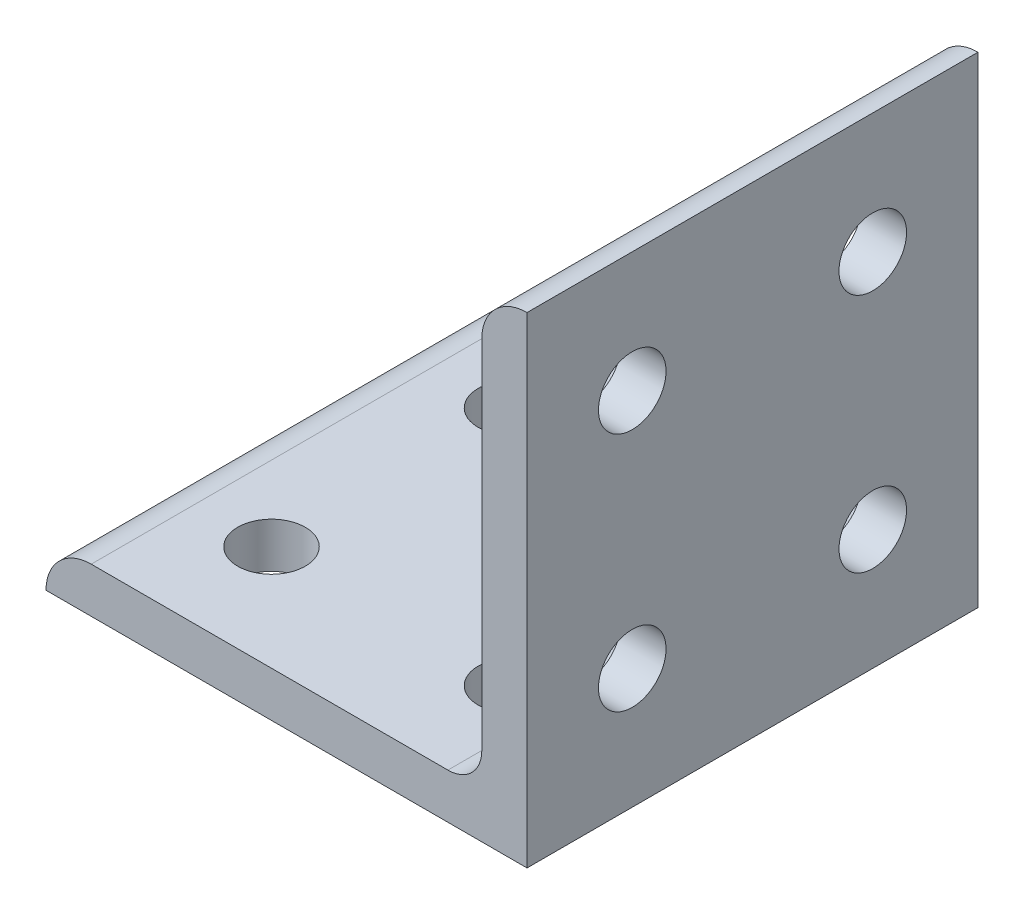
ISO-10303-21;
HEADER;
FILE_DESCRIPTION(('STEP AP214'),'2;1');
FILE_NAME('part.step','',(''),(''),'','','');
FILE_SCHEMA(('AUTOMOTIVE_DESIGN { 1 0 10303 214 1 1 1 1 }'));
ENDSEC;
DATA;
#1=APPLICATION_CONTEXT('core data for automotive mechanical design processes');
#2=APPLICATION_PROTOCOL_DEFINITION('international standard','automotive_design',2000,#1);
#3=PRODUCT_CONTEXT('',#1,'mechanical');
#4=PRODUCT('Part','Part','',(#3));
#5=PRODUCT_RELATED_PRODUCT_CATEGORY('part','',(#4));
#6=PRODUCT_DEFINITION_FORMATION('','',#4);
#7=PRODUCT_DEFINITION_CONTEXT('part definition',#1,'design');
#8=PRODUCT_DEFINITION('design','',#6,#7);
#9=PRODUCT_DEFINITION_SHAPE('','',#8);
#10=(LENGTH_UNIT() NAMED_UNIT(*) SI_UNIT(.MILLI.,.METRE.));
#11=(NAMED_UNIT(*) PLANE_ANGLE_UNIT() SI_UNIT($,.RADIAN.));
#12=(NAMED_UNIT(*) SI_UNIT($,.STERADIAN.) SOLID_ANGLE_UNIT());
#13=UNCERTAINTY_MEASURE_WITH_UNIT(LENGTH_MEASURE(1.E-05),#10,'distance_accuracy_value','');
#14=(GEOMETRIC_REPRESENTATION_CONTEXT(3) GLOBAL_UNCERTAINTY_ASSIGNED_CONTEXT((#13)) GLOBAL_UNIT_ASSIGNED_CONTEXT((#10,
#11,#12)) REPRESENTATION_CONTEXT('',''));
#15=CARTESIAN_POINT('',(0.,0.,0.));
#16=DIRECTION('',(0.,0.,1.));
#17=DIRECTION('',(1.,0.,0.));
#18=AXIS2_PLACEMENT_3D('',#15,#16,#17);
#19=CARTESIAN_POINT('',(0.,0.,-23.8125));
#20=DIRECTION('',(0.,-1.,0.));
#21=DIRECTION('',(1.,0.,0.));
#22=AXIS2_PLACEMENT_3D('',#19,#20,#21);
#23=PLANE('',#22);
#24=CARTESIAN_POINT('',(-38.1,0.,-12.7));
#25=DIRECTION('',(0.,1.,0.));
#26=DIRECTION('',(1.,0.,0.));
#27=AXIS2_PLACEMENT_3D('',#24,#25,#26);
#28=CIRCLE('',#27,3.5687);
#29=CARTESIAN_POINT('',(-34.5313,0.,-12.7));
#30=VERTEX_POINT('',#29);
#31=EDGE_CURVE('E202',#30,#30,#28,.T.);
#32=ORIENTED_EDGE('',*,*,#31,.T.);
#33=EDGE_LOOP('',(#32));
#34=FACE_BOUND('',#33,.T.);
#35=CARTESIAN_POINT('',(-12.7,0.,-12.7));
#36=DIRECTION('',(0.,1.,0.));
#37=DIRECTION('',(1.,0.,0.));
#38=AXIS2_PLACEMENT_3D('',#35,#36,#37);
#39=CIRCLE('',#38,3.5687);
#40=CARTESIAN_POINT('',(-9.13130000000004,0.,-12.7));
#41=VERTEX_POINT('',#40);
#42=EDGE_CURVE('E213',#41,#41,#39,.T.);
#43=ORIENTED_EDGE('',*,*,#42,.T.);
#44=EDGE_LOOP('',(#43));
#45=FACE_BOUND('',#44,.T.);
#46=CARTESIAN_POINT('',(-12.7,0.,12.7));
#47=DIRECTION('',(0.,1.,0.));
#48=DIRECTION('',(-1.,0.,0.));
#49=AXIS2_PLACEMENT_3D('',#46,#47,#48);
#50=CIRCLE('',#49,3.5687);
#51=CARTESIAN_POINT('',(-16.2687,0.,12.7));
#52=VERTEX_POINT('',#51);
#53=EDGE_CURVE('E219',#52,#52,#50,.T.);
#54=ORIENTED_EDGE('',*,*,#53,.T.);
#55=EDGE_LOOP('',(#54));
#56=FACE_BOUND('',#55,.T.);
#57=CARTESIAN_POINT('',(-38.1,0.,12.7));
#58=DIRECTION('',(0.,1.,0.));
#59=DIRECTION('',(-1.,0.,0.));
#60=AXIS2_PLACEMENT_3D('',#57,#58,#59);
#61=CIRCLE('',#60,3.5687);
#62=CARTESIAN_POINT('',(-41.6687,0.,12.7));
#63=VERTEX_POINT('',#62);
#64=EDGE_CURVE('E131',#63,#63,#61,.T.);
#65=ORIENTED_EDGE('',*,*,#64,.T.);
#66=EDGE_LOOP('',(#65));
#67=FACE_BOUND('',#66,.T.);
#68=DIRECTION('',(1.,0.,0.));
#69=VECTOR('',#68,1.);
#70=CARTESIAN_POINT('',(0.,0.,23.8125));
#71=LINE('',#70,#69);
#72=CARTESIAN_POINT('',(-50.8,0.,23.8125));
#73=VERTEX_POINT('',#72);
#74=CARTESIAN_POINT('',(0.,0.,23.8125));
#75=VERTEX_POINT('',#74);
#76=EDGE_CURVE('E127',#73,#75,#71,.T.);
#77=ORIENTED_EDGE('',*,*,#76,.F.);
#78=DIRECTION('',(0.,0.,1.));
#79=VECTOR('',#78,1.);
#80=CARTESIAN_POINT('',(-50.8,0.,-23.8125));
#81=LINE('',#80,#79);
#82=CARTESIAN_POINT('',(-50.8,0.,-23.8125));
#83=VERTEX_POINT('',#82);
#84=EDGE_CURVE('E11',#83,#73,#81,.T.);
#85=ORIENTED_EDGE('',*,*,#84,.F.);
#86=DIRECTION('',(1.,0.,0.));
#87=VECTOR('',#86,1.);
#88=CARTESIAN_POINT('',(0.,0.,-23.8125));
#89=LINE('',#88,#87);
#90=CARTESIAN_POINT('',(0.,0.,-23.8125));
#91=VERTEX_POINT('',#90);
#92=EDGE_CURVE('E145',#83,#91,#89,.T.);
#93=ORIENTED_EDGE('',*,*,#92,.T.);
#94=DIRECTION('',(0.,0.,1.));
#95=VECTOR('',#94,1.);
#96=CARTESIAN_POINT('',(0.,0.,-23.8125));
#97=LINE('',#96,#95);
#98=EDGE_CURVE('E39',#91,#75,#97,.T.);
#99=ORIENTED_EDGE('',*,*,#98,.T.);
#100=EDGE_LOOP('',(#77,#85,#93,#99));
#101=FACE_BOUND('',#100,.T.);
#102=ADVANCED_FACE('F36',(#34,#45,#56,#67,#101),#23,.T.);
#103=CARTESIAN_POINT('',(-46.0248,0.,-23.8125));
#104=DIRECTION('',(0.,0.,1.));
#105=DIRECTION('',(1.,0.,0.));
#106=AXIS2_PLACEMENT_3D('',#103,#104,#105);
#107=CYLINDRICAL_SURFACE('',#106,4.77519999999999);
#108=CARTESIAN_POINT('',(-46.0248,0.,23.8125));
#109=DIRECTION('',(0.,0.,1.));
#110=DIRECTION('',(-1.,0.,0.));
#111=AXIS2_PLACEMENT_3D('',#108,#109,#110);
#112=CIRCLE('',#111,4.77519999999999);
#113=CARTESIAN_POINT('',(-46.0248,4.77519999999999,23.8125));
#114=VERTEX_POINT('',#113);
#115=EDGE_CURVE('E143',#114,#73,#112,.T.);
#116=ORIENTED_EDGE('',*,*,#115,.F.);
#117=DIRECTION('',(0.,0.,1.));
#118=VECTOR('',#117,1.);
#119=CARTESIAN_POINT('',(-46.0248,4.77519999999999,-23.8125));
#120=LINE('',#119,#118);
#121=CARTESIAN_POINT('',(-46.0248,4.77519999999999,-23.8125));
#122=VERTEX_POINT('',#121);
#123=EDGE_CURVE('E45',#122,#114,#120,.T.);
#124=ORIENTED_EDGE('',*,*,#123,.F.);
#125=CARTESIAN_POINT('',(-46.0248,0.,-23.8125));
#126=DIRECTION('',(0.,0.,1.));
#127=DIRECTION('',(-1.,0.,0.));
#128=AXIS2_PLACEMENT_3D('',#125,#126,#127);
#129=CIRCLE('',#128,4.77519999999999);
#130=EDGE_CURVE('E117',#122,#83,#129,.T.);
#131=ORIENTED_EDGE('',*,*,#130,.T.);
#132=ORIENTED_EDGE('',*,*,#84,.T.);
#133=EDGE_LOOP('',(#116,#124,#131,#132));
#134=FACE_BOUND('',#133,.T.);
#135=ADVANCED_FACE('F155',(#134),#107,.T.);
#136=CARTESIAN_POINT('',(-46.0248,4.77519999999999,-23.8125));
#137=DIRECTION('',(0.,1.,0.));
#138=DIRECTION('',(-1.,0.,0.));
#139=AXIS2_PLACEMENT_3D('',#136,#137,#138);
#140=PLANE('',#139);
#141=CARTESIAN_POINT('',(-38.1,4.77519999999999,-12.7));
#142=DIRECTION('',(0.,1.,0.));
#143=DIRECTION('',(1.,0.,0.));
#144=AXIS2_PLACEMENT_3D('',#141,#142,#143);
#145=CIRCLE('',#144,3.5687);
#146=CARTESIAN_POINT('',(-34.5313,4.77519999999999,-12.7));
#147=VERTEX_POINT('',#146);
#148=EDGE_CURVE('E198',#147,#147,#145,.T.);
#149=ORIENTED_EDGE('',*,*,#148,.F.);
#150=EDGE_LOOP('',(#149));
#151=FACE_BOUND('',#150,.T.);
#152=CARTESIAN_POINT('',(-12.7,4.77519999999999,-12.7));
#153=DIRECTION('',(0.,1.,0.));
#154=DIRECTION('',(1.,0.,0.));
#155=AXIS2_PLACEMENT_3D('',#152,#153,#154);
#156=CIRCLE('',#155,3.5687);
#157=CARTESIAN_POINT('',(-9.13130000000004,4.77519999999999,-12.7));
#158=VERTEX_POINT('',#157);
#159=EDGE_CURVE('E211',#158,#158,#156,.T.);
#160=ORIENTED_EDGE('',*,*,#159,.F.);
#161=EDGE_LOOP('',(#160));
#162=FACE_BOUND('',#161,.T.);
#163=CARTESIAN_POINT('',(-12.7,4.77519999999999,12.7));
#164=DIRECTION('',(0.,1.,0.));
#165=DIRECTION('',(-1.,0.,0.));
#166=AXIS2_PLACEMENT_3D('',#163,#164,#165);
#167=CIRCLE('',#166,3.5687);
#168=CARTESIAN_POINT('',(-16.2687,4.77519999999999,12.7));
#169=VERTEX_POINT('',#168);
#170=EDGE_CURVE('E216',#169,#169,#167,.T.);
#171=ORIENTED_EDGE('',*,*,#170,.F.);
#172=EDGE_LOOP('',(#171));
#173=FACE_BOUND('',#172,.T.);
#174=CARTESIAN_POINT('',(-38.1,4.77519999999999,12.7));
#175=DIRECTION('',(0.,1.,0.));
#176=DIRECTION('',(-1.,0.,0.));
#177=AXIS2_PLACEMENT_3D('',#174,#175,#176);
#178=CIRCLE('',#177,3.5687);
#179=CARTESIAN_POINT('',(-41.6687,4.77519999999999,12.7));
#180=VERTEX_POINT('',#179);
#181=EDGE_CURVE('E222',#180,#180,#178,.T.);
#182=ORIENTED_EDGE('',*,*,#181,.F.);
#183=EDGE_LOOP('',(#182));
#184=FACE_BOUND('',#183,.T.);
#185=DIRECTION('',(-1.,0.,0.));
#186=VECTOR('',#185,1.);
#187=CARTESIAN_POINT('',(-46.0248,4.77519999999999,23.8125));
#188=LINE('',#187,#186);
#189=CARTESIAN_POINT('',(-8.35660000000005,4.77519999999999,23.8125));
#190=VERTEX_POINT('',#189);
#191=EDGE_CURVE('E104',#190,#114,#188,.T.);
#192=ORIENTED_EDGE('',*,*,#191,.F.);
#193=DIRECTION('',(0.,0.,1.));
#194=VECTOR('',#193,1.);
#195=CARTESIAN_POINT('',(-8.35660000000005,4.77519999999999,-23.8125));
#196=LINE('',#195,#194);
#197=CARTESIAN_POINT('',(-8.35660000000005,4.77519999999999,-23.8125));
#198=VERTEX_POINT('',#197);
#199=EDGE_CURVE('E99',#198,#190,#196,.T.);
#200=ORIENTED_EDGE('',*,*,#199,.F.);
#201=DIRECTION('',(-1.,0.,0.));
#202=VECTOR('',#201,1.);
#203=CARTESIAN_POINT('',(-46.0248,4.77519999999999,-23.8125));
#204=LINE('',#203,#202);
#205=EDGE_CURVE('E102',#198,#122,#204,.T.);
#206=ORIENTED_EDGE('',*,*,#205,.T.);
#207=ORIENTED_EDGE('',*,*,#123,.T.);
#208=EDGE_LOOP('',(#192,#200,#206,#207));
#209=FACE_BOUND('',#208,.T.);
#210=ADVANCED_FACE('F101',(#151,#162,#173,#184,#209),#140,.T.);
#211=CARTESIAN_POINT('',(-8.35660000000005,8.35659999999999,-23.8125));
#212=DIRECTION('',(0.,0.,1.));
#213=DIRECTION('',(1.,0.,0.));
#214=AXIS2_PLACEMENT_3D('',#211,#212,#213);
#215=CYLINDRICAL_SURFACE('',#214,3.5814);
#216=CARTESIAN_POINT('',(-8.35660000000005,8.35659999999999,23.8125));
#217=DIRECTION('',(0.,0.,-1.));
#218=DIRECTION('',(1.,0.,0.));
#219=AXIS2_PLACEMENT_3D('',#216,#217,#218);
#220=CIRCLE('',#219,3.5814);
#221=CARTESIAN_POINT('',(-4.77519999999998,8.35659999999999,23.8125));
#222=VERTEX_POINT('',#221);
#223=EDGE_CURVE('E140',#222,#190,#220,.T.);
#224=ORIENTED_EDGE('',*,*,#223,.F.);
#225=DIRECTION('',(0.,0.,1.));
#226=VECTOR('',#225,1.);
#227=CARTESIAN_POINT('',(-4.77519999999998,8.35659999999999,-23.8125));
#228=LINE('',#227,#226);
#229=CARTESIAN_POINT('',(-4.77519999999998,8.35659999999999,-23.8125));
#230=VERTEX_POINT('',#229);
#231=EDGE_CURVE('E109',#230,#222,#228,.T.);
#232=ORIENTED_EDGE('',*,*,#231,.F.);
#233=CARTESIAN_POINT('',(-8.35660000000005,8.35659999999999,-23.8125));
#234=DIRECTION('',(0.,0.,-1.));
#235=DIRECTION('',(1.,0.,0.));
#236=AXIS2_PLACEMENT_3D('',#233,#234,#235);
#237=CIRCLE('',#236,3.5814);
#238=EDGE_CURVE('E115',#230,#198,#237,.T.);
#239=ORIENTED_EDGE('',*,*,#238,.T.);
#240=ORIENTED_EDGE('',*,*,#199,.T.);
#241=EDGE_LOOP('',(#224,#232,#239,#240));
#242=FACE_BOUND('',#241,.T.);
#243=ADVANCED_FACE('F119',(#242),#215,.F.);
#244=CARTESIAN_POINT('',(-4.77519999999998,8.35659999999999,-23.8125));
#245=DIRECTION('',(-1.,0.,0.));
#246=DIRECTION('',(0.,0.,1.));
#247=AXIS2_PLACEMENT_3D('',#244,#245,#246);
#248=PLANE('',#247);
#249=CARTESIAN_POINT('',(-4.77519999999998,38.1,-12.7));
#250=DIRECTION('',(-1.,0.,0.));
#251=DIRECTION('',(0.,1.,0.));
#252=AXIS2_PLACEMENT_3D('',#249,#250,#251);
#253=CIRCLE('',#252,3.5687);
#254=CARTESIAN_POINT('',(-4.77519999999998,41.6687,-12.7));
#255=VERTEX_POINT('',#254);
#256=EDGE_CURVE('E278',#255,#255,#253,.T.);
#257=ORIENTED_EDGE('',*,*,#256,.F.);
#258=EDGE_LOOP('',(#257));
#259=FACE_BOUND('',#258,.T.);
#260=CARTESIAN_POINT('',(-4.77519999999998,12.7,-12.7));
#261=DIRECTION('',(-1.,0.,0.));
#262=DIRECTION('',(0.,1.,0.));
#263=AXIS2_PLACEMENT_3D('',#260,#261,#262);
#264=CIRCLE('',#263,3.5687);
#265=CARTESIAN_POINT('',(-4.77519999999998,16.2687,-12.7));
#266=VERTEX_POINT('',#265);
#267=EDGE_CURVE('E280',#266,#266,#264,.T.);
#268=ORIENTED_EDGE('',*,*,#267,.F.);
#269=EDGE_LOOP('',(#268));
#270=FACE_BOUND('',#269,.T.);
#271=CARTESIAN_POINT('',(-4.77519999999998,38.1,12.7));
#272=DIRECTION('',(-1.,0.,0.));
#273=DIRECTION('',(0.,-1.,0.));
#274=AXIS2_PLACEMENT_3D('',#271,#272,#273);
#275=CIRCLE('',#274,3.5687);
#276=CARTESIAN_POINT('',(-4.77519999999998,34.5313,12.7));
#277=VERTEX_POINT('',#276);
#278=EDGE_CURVE('E207',#277,#277,#275,.T.);
#279=ORIENTED_EDGE('',*,*,#278,.F.);
#280=EDGE_LOOP('',(#279));
#281=FACE_BOUND('',#280,.T.);
#282=CARTESIAN_POINT('',(-4.77519999999998,12.7,12.7));
#283=DIRECTION('',(-1.,0.,0.));
#284=DIRECTION('',(0.,-1.,0.));
#285=AXIS2_PLACEMENT_3D('',#282,#283,#284);
#286=CIRCLE('',#285,3.5687);
#287=CARTESIAN_POINT('',(-4.77519999999998,9.1313,12.7));
#288=VERTEX_POINT('',#287);
#289=EDGE_CURVE('E199',#288,#288,#286,.T.);
#290=ORIENTED_EDGE('',*,*,#289,.F.);
#291=EDGE_LOOP('',(#290));
#292=FACE_BOUND('',#291,.T.);
#293=DIRECTION('',(0.,-1.,0.));
#294=VECTOR('',#293,1.);
#295=CARTESIAN_POINT('',(-4.77519999999998,8.35659999999999,23.8125));
#296=LINE('',#295,#294);
#297=CARTESIAN_POINT('',(-4.77519999999998,46.0248,23.8125));
#298=VERTEX_POINT('',#297);
#299=EDGE_CURVE('E137',#298,#222,#296,.T.);
#300=ORIENTED_EDGE('',*,*,#299,.F.);
#301=DIRECTION('',(0.,0.,1.));
#302=VECTOR('',#301,1.);
#303=CARTESIAN_POINT('',(-4.77519999999998,46.0248,-23.8125));
#304=LINE('',#303,#302);
#305=CARTESIAN_POINT('',(-4.77519999999998,46.0248,-23.8125));
#306=VERTEX_POINT('',#305);
#307=EDGE_CURVE('E149',#306,#298,#304,.T.);
#308=ORIENTED_EDGE('',*,*,#307,.F.);
#309=DIRECTION('',(0.,-1.,0.));
#310=VECTOR('',#309,1.);
#311=CARTESIAN_POINT('',(-4.77519999999998,8.35659999999999,-23.8125));
#312=LINE('',#311,#310);
#313=EDGE_CURVE('E120',#306,#230,#312,.T.);
#314=ORIENTED_EDGE('',*,*,#313,.T.);
#315=ORIENTED_EDGE('',*,*,#231,.T.);
#316=EDGE_LOOP('',(#300,#308,#314,#315));
#317=FACE_BOUND('',#316,.T.);
#318=ADVANCED_FACE('F170',(#259,#270,#281,#292,#317),#248,.T.);
#319=CARTESIAN_POINT('',(0.,46.0248,-23.8125));
#320=DIRECTION('',(0.,0.,1.));
#321=DIRECTION('',(1.,0.,0.));
#322=AXIS2_PLACEMENT_3D('',#319,#320,#321);
#323=CYLINDRICAL_SURFACE('',#322,4.77519999999999);
#324=CARTESIAN_POINT('',(0.,46.0248,23.8125));
#325=DIRECTION('',(0.,0.,1.));
#326=DIRECTION('',(-1.,0.,0.));
#327=AXIS2_PLACEMENT_3D('',#324,#325,#326);
#328=CIRCLE('',#327,4.77519999999999);
#329=CARTESIAN_POINT('',(0.,50.8,23.8125));
#330=VERTEX_POINT('',#329);
#331=EDGE_CURVE('E134',#330,#298,#328,.T.);
#332=ORIENTED_EDGE('',*,*,#331,.F.);
#333=DIRECTION('',(0.,0.,1.));
#334=VECTOR('',#333,1.);
#335=CARTESIAN_POINT('',(0.,50.8,-23.8125));
#336=LINE('',#335,#334);
#337=CARTESIAN_POINT('',(0.,50.8,-23.8125));
#338=VERTEX_POINT('',#337);
#339=EDGE_CURVE('E150',#338,#330,#336,.T.);
#340=ORIENTED_EDGE('',*,*,#339,.F.);
#341=CARTESIAN_POINT('',(0.,46.0248,-23.8125));
#342=DIRECTION('',(0.,0.,1.));
#343=DIRECTION('',(-1.,0.,0.));
#344=AXIS2_PLACEMENT_3D('',#341,#342,#343);
#345=CIRCLE('',#344,4.77519999999999);
#346=EDGE_CURVE('E122',#338,#306,#345,.T.);
#347=ORIENTED_EDGE('',*,*,#346,.T.);
#348=ORIENTED_EDGE('',*,*,#307,.T.);
#349=EDGE_LOOP('',(#332,#340,#347,#348));
#350=FACE_BOUND('',#349,.T.);
#351=ADVANCED_FACE('F173',(#350),#323,.T.);
#352=CARTESIAN_POINT('',(0.,0.,-23.8125));
#353=DIRECTION('',(1.,0.,0.));
#354=DIRECTION('',(0.,0.,-1.));
#355=AXIS2_PLACEMENT_3D('',#352,#353,#354);
#356=PLANE('',#355);
#357=CARTESIAN_POINT('',(0.,38.1,-12.7));
#358=DIRECTION('',(-1.,0.,0.));
#359=DIRECTION('',(0.,1.,0.));
#360=AXIS2_PLACEMENT_3D('',#357,#358,#359);
#361=CIRCLE('',#360,3.5687);
#362=CARTESIAN_POINT('',(0.,41.6687,-12.7));
#363=VERTEX_POINT('',#362);
#364=EDGE_CURVE('E185',#363,#363,#361,.T.);
#365=ORIENTED_EDGE('',*,*,#364,.T.);
#366=EDGE_LOOP('',(#365));
#367=FACE_BOUND('',#366,.T.);
#368=CARTESIAN_POINT('',(0.,12.7,-12.7));
#369=DIRECTION('',(-1.,0.,0.));
#370=DIRECTION('',(0.,1.,0.));
#371=AXIS2_PLACEMENT_3D('',#368,#369,#370);
#372=CIRCLE('',#371,3.5687);
#373=CARTESIAN_POINT('',(0.,16.2687,-12.7));
#374=VERTEX_POINT('',#373);
#375=EDGE_CURVE('E189',#374,#374,#372,.T.);
#376=ORIENTED_EDGE('',*,*,#375,.T.);
#377=EDGE_LOOP('',(#376));
#378=FACE_BOUND('',#377,.T.);
#379=CARTESIAN_POINT('',(0.,38.1,12.7));
#380=DIRECTION('',(-1.,0.,0.));
#381=DIRECTION('',(0.,-1.,0.));
#382=AXIS2_PLACEMENT_3D('',#379,#380,#381);
#383=CIRCLE('',#382,3.5687);
#384=CARTESIAN_POINT('',(0.,34.5313,12.7));
#385=VERTEX_POINT('',#384);
#386=EDGE_CURVE('E193',#385,#385,#383,.T.);
#387=ORIENTED_EDGE('',*,*,#386,.T.);
#388=EDGE_LOOP('',(#387));
#389=FACE_BOUND('',#388,.T.);
#390=CARTESIAN_POINT('',(0.,12.7,12.7));
#391=DIRECTION('',(-1.,0.,0.));
#392=DIRECTION('',(0.,-1.,0.));
#393=AXIS2_PLACEMENT_3D('',#390,#391,#392);
#394=CIRCLE('',#393,3.5687);
#395=CARTESIAN_POINT('',(0.,9.1313,12.7));
#396=VERTEX_POINT('',#395);
#397=EDGE_CURVE('E196',#396,#396,#394,.T.);
#398=ORIENTED_EDGE('',*,*,#397,.T.);
#399=EDGE_LOOP('',(#398));
#400=FACE_BOUND('',#399,.T.);
#401=DIRECTION('',(0.,1.,0.));
#402=VECTOR('',#401,1.);
#403=CARTESIAN_POINT('',(0.,0.,23.8125));
#404=LINE('',#403,#402);
#405=EDGE_CURVE('E130',#75,#330,#404,.T.);
#406=ORIENTED_EDGE('',*,*,#405,.F.);
#407=ORIENTED_EDGE('',*,*,#98,.F.);
#408=DIRECTION('',(0.,1.,0.));
#409=VECTOR('',#408,1.);
#410=CARTESIAN_POINT('',(0.,0.,-23.8125));
#411=LINE('',#410,#409);
#412=EDGE_CURVE('E230',#91,#338,#411,.T.);
#413=ORIENTED_EDGE('',*,*,#412,.T.);
#414=ORIENTED_EDGE('',*,*,#339,.T.);
#415=EDGE_LOOP('',(#406,#407,#413,#414));
#416=FACE_BOUND('',#415,.T.);
#417=ADVANCED_FACE('F152',(#367,#378,#389,#400,#416),#356,.T.);
#418=CARTESIAN_POINT('',(-46.0248,0.,-23.8125));
#419=DIRECTION('',(0.,0.,-1.));
#420=DIRECTION('',(-1.,0.,0.));
#421=AXIS2_PLACEMENT_3D('',#418,#419,#420);
#422=PLANE('',#421);
#423=ORIENTED_EDGE('',*,*,#92,.F.);
#424=ORIENTED_EDGE('',*,*,#130,.F.);
#425=ORIENTED_EDGE('',*,*,#205,.F.);
#426=ORIENTED_EDGE('',*,*,#238,.F.);
#427=ORIENTED_EDGE('',*,*,#313,.F.);
#428=ORIENTED_EDGE('',*,*,#346,.F.);
#429=ORIENTED_EDGE('',*,*,#412,.F.);
#430=EDGE_LOOP('',(#423,#424,#425,#426,#427,#428,#429));
#431=FACE_BOUND('',#430,.T.);
#432=ADVANCED_FACE('F113',(#431),#422,.T.);
#433=CARTESIAN_POINT('',(-46.0248,0.,23.8125));
#434=DIRECTION('',(0.,0.,-1.));
#435=DIRECTION('',(-1.,0.,0.));
#436=AXIS2_PLACEMENT_3D('',#433,#434,#435);
#437=PLANE('',#436);
#438=ORIENTED_EDGE('',*,*,#76,.T.);
#439=ORIENTED_EDGE('',*,*,#405,.T.);
#440=ORIENTED_EDGE('',*,*,#331,.T.);
#441=ORIENTED_EDGE('',*,*,#299,.T.);
#442=ORIENTED_EDGE('',*,*,#223,.T.);
#443=ORIENTED_EDGE('',*,*,#191,.T.);
#444=ORIENTED_EDGE('',*,*,#115,.T.);
#445=EDGE_LOOP('',(#438,#439,#440,#441,#442,#443,#444));
#446=FACE_BOUND('',#445,.T.);
#447=ADVANCED_FACE('F154',(#446),#437,.F.);
#448=CARTESIAN_POINT('',(-38.1,0.,12.7));
#449=DIRECTION('',(0.,1.,0.));
#450=DIRECTION('',(-1.,0.,0.));
#451=AXIS2_PLACEMENT_3D('',#448,#449,#450);
#452=CYLINDRICAL_SURFACE('',#451,3.5687);
#453=ORIENTED_EDGE('',*,*,#64,.F.);
#454=EDGE_LOOP('',(#453));
#455=FACE_BOUND('',#454,.T.);
#456=ORIENTED_EDGE('',*,*,#181,.T.);
#457=EDGE_LOOP('',(#456));
#458=FACE_BOUND('',#457,.T.);
#459=ADVANCED_FACE('F237',(#455,#458),#452,.F.);
#460=CARTESIAN_POINT('',(-12.7,0.,12.7));
#461=DIRECTION('',(0.,1.,0.));
#462=DIRECTION('',(-1.,0.,0.));
#463=AXIS2_PLACEMENT_3D('',#460,#461,#462);
#464=CYLINDRICAL_SURFACE('',#463,3.5687);
#465=ORIENTED_EDGE('',*,*,#53,.F.);
#466=EDGE_LOOP('',(#465));
#467=FACE_BOUND('',#466,.T.);
#468=ORIENTED_EDGE('',*,*,#170,.T.);
#469=EDGE_LOOP('',(#468));
#470=FACE_BOUND('',#469,.T.);
#471=ADVANCED_FACE('F240',(#467,#470),#464,.F.);
#472=CARTESIAN_POINT('',(-12.7,0.,-12.7));
#473=DIRECTION('',(0.,1.,0.));
#474=DIRECTION('',(-1.,0.,0.));
#475=AXIS2_PLACEMENT_3D('',#472,#473,#474);
#476=CYLINDRICAL_SURFACE('',#475,3.5687);
#477=ORIENTED_EDGE('',*,*,#42,.F.);
#478=EDGE_LOOP('',(#477));
#479=FACE_BOUND('',#478,.T.);
#480=ORIENTED_EDGE('',*,*,#159,.T.);
#481=EDGE_LOOP('',(#480));
#482=FACE_BOUND('',#481,.T.);
#483=ADVANCED_FACE('F247',(#479,#482),#476,.F.);
#484=CARTESIAN_POINT('',(-38.1,0.,-12.7));
#485=DIRECTION('',(0.,1.,0.));
#486=DIRECTION('',(-1.,0.,0.));
#487=AXIS2_PLACEMENT_3D('',#484,#485,#486);
#488=CYLINDRICAL_SURFACE('',#487,3.5687);
#489=ORIENTED_EDGE('',*,*,#31,.F.);
#490=EDGE_LOOP('',(#489));
#491=FACE_BOUND('',#490,.T.);
#492=ORIENTED_EDGE('',*,*,#148,.T.);
#493=EDGE_LOOP('',(#492));
#494=FACE_BOUND('',#493,.T.);
#495=ADVANCED_FACE('F254',(#491,#494),#488,.F.);
#496=CARTESIAN_POINT('',(0.,12.7,12.7));
#497=DIRECTION('',(-1.,0.,0.));
#498=DIRECTION('',(0.,-1.,0.));
#499=AXIS2_PLACEMENT_3D('',#496,#497,#498);
#500=CYLINDRICAL_SURFACE('',#499,3.5687);
#501=ORIENTED_EDGE('',*,*,#397,.F.);
#502=EDGE_LOOP('',(#501));
#503=FACE_BOUND('',#502,.T.);
#504=ORIENTED_EDGE('',*,*,#289,.T.);
#505=EDGE_LOOP('',(#504));
#506=FACE_BOUND('',#505,.T.);
#507=ADVANCED_FACE('F258',(#503,#506),#500,.F.);
#508=CARTESIAN_POINT('',(0.,38.1,12.7));
#509=DIRECTION('',(-1.,0.,0.));
#510=DIRECTION('',(0.,-1.,0.));
#511=AXIS2_PLACEMENT_3D('',#508,#509,#510);
#512=CYLINDRICAL_SURFACE('',#511,3.5687);
#513=ORIENTED_EDGE('',*,*,#386,.F.);
#514=EDGE_LOOP('',(#513));
#515=FACE_BOUND('',#514,.T.);
#516=ORIENTED_EDGE('',*,*,#278,.T.);
#517=EDGE_LOOP('',(#516));
#518=FACE_BOUND('',#517,.T.);
#519=ADVANCED_FACE('F262',(#515,#518),#512,.F.);
#520=CARTESIAN_POINT('',(0.,12.7,-12.7));
#521=DIRECTION('',(-1.,0.,0.));
#522=DIRECTION('',(0.,-1.,0.));
#523=AXIS2_PLACEMENT_3D('',#520,#521,#522);
#524=CYLINDRICAL_SURFACE('',#523,3.5687);
#525=ORIENTED_EDGE('',*,*,#375,.F.);
#526=EDGE_LOOP('',(#525));
#527=FACE_BOUND('',#526,.T.);
#528=ORIENTED_EDGE('',*,*,#267,.T.);
#529=EDGE_LOOP('',(#528));
#530=FACE_BOUND('',#529,.T.);
#531=ADVANCED_FACE('F265',(#527,#530),#524,.F.);
#532=CARTESIAN_POINT('',(0.,38.1,-12.7));
#533=DIRECTION('',(-1.,0.,0.));
#534=DIRECTION('',(0.,-1.,0.));
#535=AXIS2_PLACEMENT_3D('',#532,#533,#534);
#536=CYLINDRICAL_SURFACE('',#535,3.5687);
#537=ORIENTED_EDGE('',*,*,#364,.F.);
#538=EDGE_LOOP('',(#537));
#539=FACE_BOUND('',#538,.T.);
#540=ORIENTED_EDGE('',*,*,#256,.T.);
#541=EDGE_LOOP('',(#540));
#542=FACE_BOUND('',#541,.T.);
#543=ADVANCED_FACE('F269',(#539,#542),#536,.F.);
#544=CLOSED_SHELL('',(#102,#135,#210,#243,#318,#351,#417,#432,#447,#459,#471,#483,#495,#507,
#519,#531,#543));
#545=MANIFOLD_SOLID_BREP('B2',#544);
#546=ADVANCED_BREP_SHAPE_REPRESENTATION('',(#18,#545),#14);
#547=SHAPE_DEFINITION_REPRESENTATION(#9,#546);
ENDSEC;
END-ISO-10303-21;
